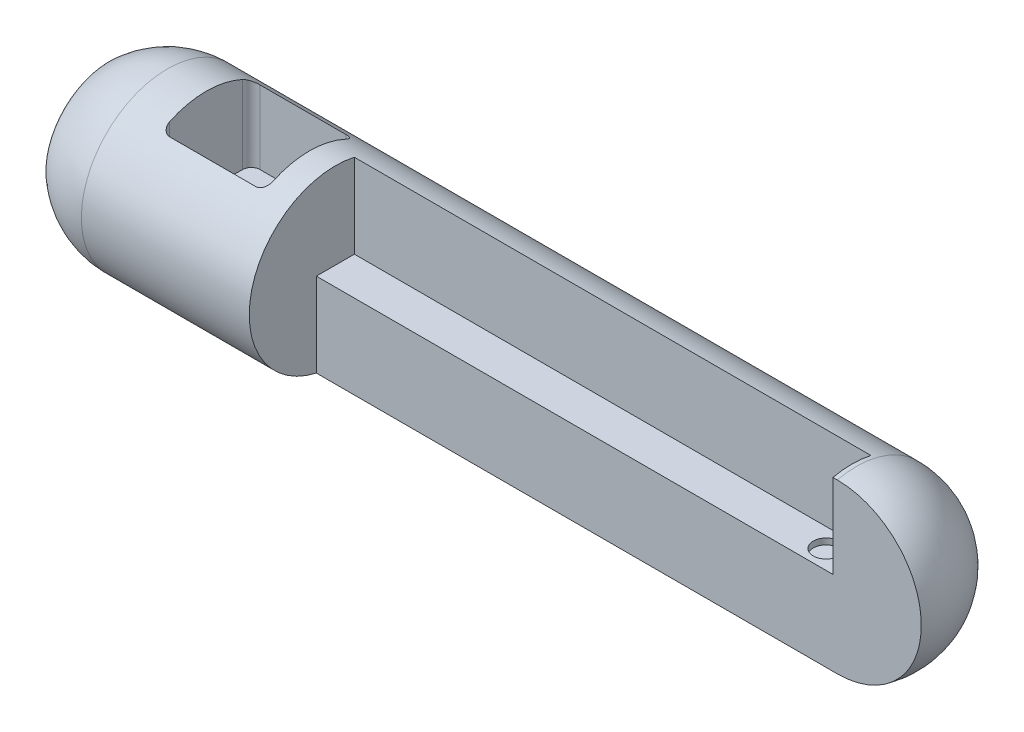
ISO-10303-21;
HEADER;
FILE_DESCRIPTION(('STEP AP214'),'2;1');
FILE_NAME('part.step','',(''),(''),'','','');
FILE_SCHEMA(('AUTOMOTIVE_DESIGN { 1 0 10303 214 1 1 1 1 }'));
ENDSEC;
DATA;
#1=APPLICATION_CONTEXT('core data for automotive mechanical design processes');
#2=APPLICATION_PROTOCOL_DEFINITION('international standard','automotive_design',2000,#1);
#3=PRODUCT_CONTEXT('',#1,'mechanical');
#4=PRODUCT('Part','Part','',(#3));
#5=PRODUCT_RELATED_PRODUCT_CATEGORY('part','',(#4));
#6=PRODUCT_DEFINITION_FORMATION('','',#4);
#7=PRODUCT_DEFINITION_CONTEXT('part definition',#1,'design');
#8=PRODUCT_DEFINITION('design','',#6,#7);
#9=PRODUCT_DEFINITION_SHAPE('','',#8);
#10=(LENGTH_UNIT() NAMED_UNIT(*) SI_UNIT(.MILLI.,.METRE.));
#11=(NAMED_UNIT(*) PLANE_ANGLE_UNIT() SI_UNIT($,.RADIAN.));
#12=(NAMED_UNIT(*) SI_UNIT($,.STERADIAN.) SOLID_ANGLE_UNIT());
#13=UNCERTAINTY_MEASURE_WITH_UNIT(LENGTH_MEASURE(1.E-05),#10,'distance_accuracy_value','');
#14=(GEOMETRIC_REPRESENTATION_CONTEXT(3) GLOBAL_UNCERTAINTY_ASSIGNED_CONTEXT((#13)) GLOBAL_UNIT_ASSIGNED_CONTEXT((#10,
#11,#12)) REPRESENTATION_CONTEXT('',''));
#15=CARTESIAN_POINT('',(0.,0.,0.));
#16=DIRECTION('',(0.,0.,1.));
#17=DIRECTION('',(1.,0.,0.));
#18=AXIS2_PLACEMENT_3D('',#15,#16,#17);
#19=CARTESIAN_POINT('',(0.,0.,0.));
#20=DIRECTION('',(-1.,0.,0.));
#21=DIRECTION('',(0.,0.,1.));
#22=AXIS2_PLACEMENT_3D('',#19,#20,#21);
#23=CYLINDRICAL_SURFACE('',#22,100.);
#24=CARTESIAN_POINT('',(144.992275313291,0.,0.));
#25=DIRECTION('',(1.,0.,0.));
#26=DIRECTION('',(0.,0.,-1.));
#27=AXIS2_PLACEMENT_3D('',#24,#25,#26);
#28=CIRCLE('',#27,100.);
#29=CARTESIAN_POINT('',(144.992275313291,90.5790034168391,-42.3726815296394));
#30=VERTEX_POINT('',#29);
#31=CARTESIAN_POINT('',(144.992275313291,90.5790034168392,42.3726815296393));
#32=VERTEX_POINT('',#31);
#33=EDGE_CURVE('E228',#30,#32,#28,.T.);
#34=ORIENTED_EDGE('',*,*,#33,.F.);
#35=CARTESIAN_POINT('',(144.992275313291,90.5790034168391,-42.3726815296394));
#36=CARTESIAN_POINT('',(144.992266455673,90.4327390532218,-42.6853887241199));
#37=CARTESIAN_POINT('',(145.006941937073,90.2848371835829,-42.9972956829604));
#38=CARTESIAN_POINT('',(145.065155574035,89.9869117356524,-43.6173482393163));
#39=CARTESIAN_POINT('',(145.108690953883,89.8368883627625,-43.9254941956582));
#40=CARTESIAN_POINT('',(145.224187646977,89.5356645003747,-44.5362900965118));
#41=CARTESIAN_POINT('',(145.296182917584,89.3844628169994,-44.8389330221261));
#42=CARTESIAN_POINT('',(145.468057545664,89.0822813849903,-45.436319477874));
#43=CARTESIAN_POINT('',(145.567937535926,88.9313016414712,-45.7310628285757));
#44=CARTESIAN_POINT('',(145.795038811292,88.6308562869436,-46.3106672280128));
#45=CARTESIAN_POINT('',(145.922262647325,88.4813908185663,-46.5955273518524));
#46=CARTESIAN_POINT('',(146.20352508244,88.185341391298,-47.1534232038708));
#47=CARTESIAN_POINT('',(146.357573009516,88.0387584545986,-47.426454777325));
#48=CARTESIAN_POINT('',(146.691794819526,87.750098730746,-47.9584375771485));
#49=CARTESIAN_POINT('',(146.871960823601,87.6080206003555,-48.2173930174908));
#50=CARTESIAN_POINT('',(147.257774886447,87.3299879200957,-48.719148982421));
#51=CARTESIAN_POINT('',(147.463423160135,87.194033421886,-48.9619493707319));
#52=CARTESIAN_POINT('',(147.893416699236,86.9336802151978,-49.4227008348896));
#53=CARTESIAN_POINT('',(148.117098414143,86.8090673792119,-49.6411492840996));
#54=CARTESIAN_POINT('',(148.586703051518,86.5692466260571,-50.0581999249176));
#55=CARTESIAN_POINT('',(148.832614451518,86.4540338947236,-50.256812287198));
#56=CARTESIAN_POINT('',(149.345462151893,86.2349095563728,-50.631882867991));
#57=CARTESIAN_POINT('',(149.612395645411,86.1309964450335,-50.8083440359831));
#58=CARTESIAN_POINT('',(150.165579457019,85.9365107152564,-51.1366066955166));
#59=CARTESIAN_POINT('',(150.451825356201,85.8459350600439,-51.288413801297));
#60=CARTESIAN_POINT('',(151.004998860787,85.6903878142627,-51.5478168037729));
#61=CARTESIAN_POINT('',(151.269954383665,85.6236361101927,-51.6585563345459));
#62=CARTESIAN_POINT('',(151.811034830617,85.5032627887518,-51.8575509786716));
#63=CARTESIAN_POINT('',(152.087157225089,85.4496382169235,-51.945811151521));
#64=CARTESIAN_POINT('',(152.647563022696,85.3567898078448,-52.0982379113052));
#65=CARTESIAN_POINT('',(152.931823843795,85.3175296328827,-52.1624653036134));
#66=CARTESIAN_POINT('',(153.50635729278,85.2541628258315,-52.2659682373049));
#67=CARTESIAN_POINT('',(153.796625089994,85.2300444714877,-52.3052630808252));
#68=CARTESIAN_POINT('',(154.238588367731,85.2054064705927,-52.3453812000194));
#69=CARTESIAN_POINT('',(154.389180251192,85.1991146450061,-52.3556201362944));
#70=CARTESIAN_POINT('',(154.690597701414,85.1907265806318,-52.3692671025232));
#71=CARTESIAN_POINT('',(154.841422728266,85.1886250219639,-52.3726837938726));
#72=CARTESIAN_POINT('',(154.992275313291,85.1886273477567,-52.3726815296394));
#73=B_SPLINE_CURVE_WITH_KNOTS('',3,(#35,#36,#37,#38,#39,#40,#41,#42,#43,#44,#45,#46,#47,#48,#49,
#50,#51,#52,#53,#54,#55,#56,#57,#58,#59,#60,#61,#62,#63,#64,#65,#66,#67,#68,#69,#70,#71,#72),
.UNSPECIFIED.,.F.,.F.,(4,2,2,2,2,2,2,2,2,2,2,2,2,2,2,2,2,2,4),(0.,1.03530983791411,
2.07052011533844,3.10696931642731,4.14344203962534,5.18001149818633,6.2169421430761,
7.25356063268882,8.29018786565977,9.29852019717618,10.3063328373354,11.3140111423901,
12.3214596555464,13.2046453057677,14.0876319987211,14.9683692923994,15.8484239073268,
16.3014494641075,16.7538995014114),.UNSPECIFIED.);
#74=CARTESIAN_POINT('',(154.992275313291,85.1886273477567,-52.3726815296394));
#75=VERTEX_POINT('',#74);
#76=EDGE_CURVE('E49',#30,#75,#73,.T.);
#77=ORIENTED_EDGE('',*,*,#76,.T.);
#78=DIRECTION('',(-1.,0.,0.));
#79=VECTOR('',#78,1.);
#80=CARTESIAN_POINT('',(0.,85.1886273477567,-52.3726815296394));
#81=LINE('',#80,#79);
#82=CARTESIAN_POINT('',(254.992275313291,85.1886273477567,-52.3726815296394));
#83=VERTEX_POINT('',#82);
#84=EDGE_CURVE('E220',#83,#75,#81,.T.);
#85=ORIENTED_EDGE('',*,*,#84,.F.);
#86=CARTESIAN_POINT('',(254.992275313291,85.1886273477567,-52.3726815296394));
#87=CARTESIAN_POINT('',(255.118945991111,85.1886263168288,-52.3726824767199));
#88=CARTESIAN_POINT('',(255.245599384915,85.1901074107686,-52.3702741710501));
#89=CARTESIAN_POINT('',(255.498651280743,85.1960201320163,-52.3606550761205));
#90=CARTESIAN_POINT('',(255.625049789664,85.2004516783693,-52.3534444186283));
#91=CARTESIAN_POINT('',(256.003376527491,85.2181437622612,-52.3246454199057));
#92=CARTESIAN_POINT('',(256.25460363012,85.2358017819059,-52.2958900074209));
#93=CARTESIAN_POINT('',(256.751836404865,85.2824027502174,-52.219859635304));
#94=CARTESIAN_POINT('',(256.997861872163,85.3112889650416,-52.1726777752802));
#95=CARTESIAN_POINT('',(257.484276800406,85.3798410827392,-52.0604173677622));
#96=CARTESIAN_POINT('',(257.724665896163,85.4195076820039,-51.9953376640997));
#97=CARTESIAN_POINT('',(258.197824873569,85.5088880193993,-51.8482155445565));
#98=CARTESIAN_POINT('',(258.430606286671,85.5585856457407,-51.766200325615));
#99=CARTESIAN_POINT('',(258.88768124347,85.6673238387794,-51.5860513247685));
#100=CARTESIAN_POINT('',(259.111971515159,85.7263679625823,-51.4879114055563));
#101=CARTESIAN_POINT('',(259.550957452831,85.8529949190893,-51.2764901793884));
#102=CARTESIAN_POINT('',(259.765647097481,85.9205830114844,-51.1631995430994));
#103=CARTESIAN_POINT('',(260.184409281917,86.0634323947222,-50.9225411103541));
#104=CARTESIAN_POINT('',(260.388477684314,86.1386966424362,-50.7951678876556));
#105=CARTESIAN_POINT('',(260.797821443829,86.3010474836128,-50.5188723053816));
#106=CARTESIAN_POINT('',(261.00234140876,86.3885821398158,-50.3690932040207));
#107=CARTESIAN_POINT('',(261.397684631324,86.5703367826651,-50.0560648253454));
#108=CARTESIAN_POINT('',(261.588502894187,86.664559182598,-49.8928106820359));
#109=CARTESIAN_POINT('',(262.139388164444,86.9557670338308,-49.3846787450864));
#110=CARTESIAN_POINT('',(262.478127892948,87.1613908386324,-49.0212662389981));
#111=CARTESIAN_POINT('',(263.137631046763,87.6180639856599,-48.2008810214119));
#112=CARTESIAN_POINT('',(263.4492763587,87.8714467351585,-47.7379300538733));
#113=CARTESIAN_POINT('',(263.98993676309,88.3896930072042,-46.7713849162086));
#114=CARTESIAN_POINT('',(264.21890237762,88.6545632983953,-46.2677666294085));
#115=CARTESIAN_POINT('',(264.501600361948,89.0599011115411,-45.4799612963182));
#116=CARTESIAN_POINT('',(264.586761184652,89.1992613213622,-45.2060630743392));
#117=CARTESIAN_POINT('',(264.73328873568,89.4779621729497,-44.6518792811238));
#118=CARTESIAN_POINT('',(264.794655019082,89.6173028143015,-44.3715935905552));
#119=CARTESIAN_POINT('',(264.89310140332,89.8948770497267,-43.8065061886779));
#120=CARTESIAN_POINT('',(264.930198079072,90.0331113355214,-43.5217076958163));
#121=CARTESIAN_POINT('',(264.979787916748,90.3076941522166,-42.9490612154214));
#122=CARTESIAN_POINT('',(264.992279814023,90.4440425858294,-42.661213071905));
#123=CARTESIAN_POINT('',(264.992275313291,90.5790034168391,-42.3726815296394));
#124=B_SPLINE_CURVE_WITH_KNOTS('',3,(#86,#87,#88,#89,#90,#91,#92,#93,#94,#95,#96,#97,#98,#99,
#100,#101,#102,#103,#104,#105,#106,#107,#108,#109,#110,#111,#112,#113,#114,#115,#116,#117,#118,
#119,#120,#121,#122,#123),.UNSPECIFIED.,.F.,.F.,(4,2,2,2,2,2,2,2,2,2,2,2,2,2,2,2,2,2,4),(0.,
0.379946210549352,0.759881996515674,1.51925238227265,2.2748346785362,3.03046579551688,
3.78489274371263,4.53960750635184,5.29478915693211,6.05026281172443,6.85398882584001,
7.65800635535124,9.26512344844026,11.096696981441,12.9293647716699,13.8852609326095,
14.8411749665076,15.7964354760417,16.7517450832452),.UNSPECIFIED.);
#125=CARTESIAN_POINT('',(264.992275313291,90.5790034168391,-42.3726815296394));
#126=VERTEX_POINT('',#125);
#127=EDGE_CURVE('E11',#83,#126,#124,.T.);
#128=ORIENTED_EDGE('',*,*,#127,.T.);
#129=CARTESIAN_POINT('',(264.992275313291,0.,0.));
#130=DIRECTION('',(-1.,0.,0.));
#131=DIRECTION('',(0.,0.,1.));
#132=AXIS2_PLACEMENT_3D('',#129,#130,#131);
#133=CIRCLE('',#132,100.);
#134=CARTESIAN_POINT('',(264.992275313291,90.5790034168392,42.3726815296393));
#135=VERTEX_POINT('',#134);
#136=EDGE_CURVE('E222',#135,#126,#133,.T.);
#137=ORIENTED_EDGE('',*,*,#136,.F.);
#138=CARTESIAN_POINT('',(264.992275313291,90.5790034168392,42.3726815296393));
#139=CARTESIAN_POINT('',(264.992284170908,90.4327390532219,42.6853887241197));
#140=CARTESIAN_POINT('',(264.977608689508,90.284837183583,42.9972956829603));
#141=CARTESIAN_POINT('',(264.919395052547,89.9869117356525,43.6173482393161));
#142=CARTESIAN_POINT('',(264.875859672698,89.8368883627626,43.9254941956581));
#143=CARTESIAN_POINT('',(264.760362979605,89.5356645003748,44.5362900965117));
#144=CARTESIAN_POINT('',(264.688367708997,89.3844628169994,44.8389330221259));
#145=CARTESIAN_POINT('',(264.516493080918,89.0822813849903,45.4363194778738));
#146=CARTESIAN_POINT('',(264.416613090656,88.9313016414712,45.7310628285756));
#147=CARTESIAN_POINT('',(264.18951181529,88.6308562869437,46.3106672280126));
#148=CARTESIAN_POINT('',(264.062287979257,88.4813908185664,46.5955273518523));
#149=CARTESIAN_POINT('',(263.781025544142,88.1853413912981,47.1534232038707));
#150=CARTESIAN_POINT('',(263.626977617066,88.0387584545987,47.4264547773249));
#151=CARTESIAN_POINT('',(263.292755807055,87.7500987307461,47.9584375771484));
#152=CARTESIAN_POINT('',(263.112589802981,87.6080206003556,48.2173930174906));
#153=CARTESIAN_POINT('',(262.726775740134,87.3299879200958,48.7191489824208));
#154=CARTESIAN_POINT('',(262.521127466447,87.1940334218861,48.9619493707317));
#155=CARTESIAN_POINT('',(262.091133927346,86.9336802151979,49.4227008348895));
#156=CARTESIAN_POINT('',(261.867452212439,86.809067379212,49.6411492840994));
#157=CARTESIAN_POINT('',(261.397847575064,86.5692466260572,50.0581999249174));
#158=CARTESIAN_POINT('',(261.151936175063,86.4540338947237,50.2568122871979));
#159=CARTESIAN_POINT('',(260.639088474689,86.2349095563729,50.6318828679908));
#160=CARTESIAN_POINT('',(260.372154981171,86.1309964450336,50.808344035983));
#161=CARTESIAN_POINT('',(259.818971169563,85.9365107152565,51.1366066955164));
#162=CARTESIAN_POINT('',(259.532725270381,85.845935060044,51.2884138012968));
#163=CARTESIAN_POINT('',(258.979551765795,85.6903878142628,51.5478168037727));
#164=CARTESIAN_POINT('',(258.714596242917,85.6236361101928,51.6585563345458));
#165=CARTESIAN_POINT('',(258.173515795964,85.5032627887519,51.8575509786714));
#166=CARTESIAN_POINT('',(257.897393401492,85.4496382169236,51.9458111515208));
#167=CARTESIAN_POINT('',(257.336987603886,85.3567898078449,52.098237911305));
#168=CARTESIAN_POINT('',(257.052726782787,85.3175296328828,52.1624653036132));
#169=CARTESIAN_POINT('',(256.478193333802,85.2541628258316,52.2659682373047));
#170=CARTESIAN_POINT('',(256.187925536587,85.2300444714878,52.3052630808251));
#171=CARTESIAN_POINT('',(255.745962258851,85.2054064705928,52.3453812000193));
#172=CARTESIAN_POINT('',(255.595370375389,85.1991146450062,52.3556201362943));
#173=CARTESIAN_POINT('',(255.293952925168,85.1907265806319,52.3692671025231));
#174=CARTESIAN_POINT('',(255.143127898315,85.188625021964,52.3726837938725));
#175=CARTESIAN_POINT('',(254.992275313291,85.1886273477568,52.3726815296393));
#176=B_SPLINE_CURVE_WITH_KNOTS('',3,(#138,#139,#140,#141,#142,#143,#144,#145,#146,#147,#148,
#149,#150,#151,#152,#153,#154,#155,#156,#157,#158,#159,#160,#161,#162,#163,#164,#165,#166,#167,
#168,#169,#170,#171,#172,#173,#174,#175),.UNSPECIFIED.,.F.,.F.,(4,2,2,2,2,2,2,2,2,2,2,2,2,2,2,2,
2,2,4),(0.,1.03530983791409,2.07052011533841,3.1069693164273,4.14344203962532,5.18001149818632,
6.21694214307607,7.25356063268874,8.29018786565969,9.29852019717612,10.3063328373353,
11.31401114239,12.3214596555464,13.2046453057676,14.087631998721,14.9683692923993,
15.8484239073267,16.3014494641074,16.7538995014114),.UNSPECIFIED.);
#177=CARTESIAN_POINT('',(254.992275313291,85.1886273477567,52.3726815296393));
#178=VERTEX_POINT('',#177);
#179=EDGE_CURVE('E258',#135,#178,#176,.T.);
#180=ORIENTED_EDGE('',*,*,#179,.T.);
#181=DIRECTION('',(-1.,0.,0.));
#182=VECTOR('',#181,1.);
#183=CARTESIAN_POINT('',(0.,85.1886273477567,52.3726815296393));
#184=LINE('',#183,#182);
#185=CARTESIAN_POINT('',(154.992275313291,85.1886273477567,52.3726815296393));
#186=VERTEX_POINT('',#185);
#187=EDGE_CURVE('E225',#186,#178,#184,.F.);
#188=ORIENTED_EDGE('',*,*,#187,.F.);
#189=CARTESIAN_POINT('',(154.992275313291,85.1886273477567,52.3726815296393));
#190=CARTESIAN_POINT('',(154.865604635471,85.1886263168288,52.3726824767198));
#191=CARTESIAN_POINT('',(154.738951241666,85.1901074107686,52.3702741710499));
#192=CARTESIAN_POINT('',(154.485899345838,85.1960201320164,52.3606550761204));
#193=CARTESIAN_POINT('',(154.359500836917,85.2004516783694,52.3534444186282));
#194=CARTESIAN_POINT('',(153.98117409909,85.2181437622613,52.3246454199055));
#195=CARTESIAN_POINT('',(153.729946996462,85.2358017819059,52.2958900074208));
#196=CARTESIAN_POINT('',(153.232714221716,85.2824027502175,52.2198596353039));
#197=CARTESIAN_POINT('',(152.986688754419,85.3112889650417,52.1726777752801));
#198=CARTESIAN_POINT('',(152.500273826176,85.3798410827393,52.0604173677621));
#199=CARTESIAN_POINT('',(152.259884730419,85.4195076820039,51.9953376640996));
#200=CARTESIAN_POINT('',(151.786725753012,85.5088880193994,51.8482155445563));
#201=CARTESIAN_POINT('',(151.553944339911,85.5585856457407,51.7662003256149));
#202=CARTESIAN_POINT('',(151.096869383112,85.6673238387795,51.5860513247683));
#203=CARTESIAN_POINT('',(150.872579111422,85.7263679625824,51.4879114055562));
#204=CARTESIAN_POINT('',(150.433593173751,85.8529949190894,51.2764901793883));
#205=CARTESIAN_POINT('',(150.2189035291,85.9205830114845,51.1631995430993));
#206=CARTESIAN_POINT('',(149.800141344664,86.0634323947223,50.922541110354));
#207=CARTESIAN_POINT('',(149.596072942267,86.1386966424363,50.7951678876555));
#208=CARTESIAN_POINT('',(149.186729182753,86.3010474836128,50.5188723053815));
#209=CARTESIAN_POINT('',(148.982209217821,86.3885821398159,50.3690932040206));
#210=CARTESIAN_POINT('',(148.586865995258,86.5703367826651,50.0560648253453));
#211=CARTESIAN_POINT('',(148.396047732394,86.6645591825981,49.8928106820357));
#212=CARTESIAN_POINT('',(147.845162462137,86.9557670338308,49.3846787450863));
#213=CARTESIAN_POINT('',(147.506422733634,87.1613908386324,49.021266238998));
#214=CARTESIAN_POINT('',(146.846919579819,87.61806398566,48.2008810214118));
#215=CARTESIAN_POINT('',(146.535274267882,87.8714467351585,47.7379300538732));
#216=CARTESIAN_POINT('',(145.994613863492,88.3896930072043,46.7713849162085));
#217=CARTESIAN_POINT('',(145.765648248962,88.6545632983953,46.2677666294084));
#218=CARTESIAN_POINT('',(145.482950264634,89.0599011115411,45.4799612963181));
#219=CARTESIAN_POINT('',(145.397789441929,89.1992613213622,45.2060630743391));
#220=CARTESIAN_POINT('',(145.251261890901,89.4779621729497,44.6518792811237));
#221=CARTESIAN_POINT('',(145.1898956075,89.6173028143016,44.3715935905551));
#222=CARTESIAN_POINT('',(145.091449223261,89.8948770497268,43.8065061886778));
#223=CARTESIAN_POINT('',(145.054352547509,90.0331113355215,43.5217076958162));
#224=CARTESIAN_POINT('',(145.004762709833,90.3076941522166,42.9490612154213));
#225=CARTESIAN_POINT('',(144.992270812559,90.4440425858295,42.6612130719049));
#226=CARTESIAN_POINT('',(144.992275313291,90.5790034168392,42.3726815296393));
#227=B_SPLINE_CURVE_WITH_KNOTS('',3,(#189,#190,#191,#192,#193,#194,#195,#196,#197,#198,#199,
#200,#201,#202,#203,#204,#205,#206,#207,#208,#209,#210,#211,#212,#213,#214,#215,#216,#217,#218,
#219,#220,#221,#222,#223,#224,#225,#226),.UNSPECIFIED.,.F.,.F.,(4,2,2,2,2,2,2,2,2,2,2,2,2,2,2,2,
2,2,4),(0.,0.379946210549297,0.759881996515591,1.51925238227257,2.2748346785362,
3.03046579551686,3.78489274371261,4.53960750635185,5.29478915693211,6.05026281172439,
6.85398882584004,7.65800635535117,9.26512344844022,11.0966969814409,12.9293647716699,
13.8852609326095,14.8411749665075,15.7964354760417,16.7517450832452),.UNSPECIFIED.);
#228=EDGE_CURVE('E265',#186,#32,#227,.T.);
#229=ORIENTED_EDGE('',*,*,#228,.T.);
#230=EDGE_LOOP('',(#34,#77,#85,#128,#137,#180,#188,#229));
#231=FACE_BOUND('',#230,.T.);
#232=CARTESIAN_POINT('',(99.9999999999999,0.,0.));
#233=DIRECTION('',(-1.,0.,0.));
#234=DIRECTION('',(0.,0.,1.));
#235=AXIS2_PLACEMENT_3D('',#232,#233,#234);
#236=CIRCLE('',#235,99.9999999999999);
#237=CARTESIAN_POINT('',(99.9999999999999,0.,99.9999999999999));
#238=VERTEX_POINT('',#237);
#239=EDGE_CURVE('E207',#238,#238,#236,.T.);
#240=ORIENTED_EDGE('',*,*,#239,.F.);
#241=EDGE_LOOP('',(#240));
#242=FACE_BOUND('',#241,.T.);
#243=DIRECTION('',(-1.,0.,0.));
#244=VECTOR('',#243,1.);
#245=CARTESIAN_POINT('',(0.,97.532026968896,22.0794863015094));
#246=LINE('',#245,#244);
#247=CARTESIAN_POINT('',(900.,97.532026968896,22.0794863015094));
#248=VERTEX_POINT('',#247);
#249=CARTESIAN_POINT('',(895.,97.5320269688959,22.0794863015094));
#250=VERTEX_POINT('',#249);
#251=EDGE_CURVE('E165',#248,#250,#246,.T.);
#252=ORIENTED_EDGE('',*,*,#251,.F.);
#253=CARTESIAN_POINT('',(900.,0.,0.));
#254=DIRECTION('',(-1.,0.,0.));
#255=DIRECTION('',(0.,0.,1.));
#256=AXIS2_PLACEMENT_3D('',#253,#254,#255);
#257=CIRCLE('',#256,100.);
#258=CARTESIAN_POINT('',(900.,-97.532026968896,22.0794863015094));
#259=VERTEX_POINT('',#258);
#260=EDGE_CURVE('E152',#248,#259,#257,.T.);
#261=ORIENTED_EDGE('',*,*,#260,.T.);
#262=DIRECTION('',(-1.,0.,0.));
#263=VECTOR('',#262,1.);
#264=CARTESIAN_POINT('',(0.,-97.532026968896,22.0794863015094));
#265=LINE('',#264,#263);
#266=CARTESIAN_POINT('',(295.,-97.532026968896,22.0794863015094));
#267=VERTEX_POINT('',#266);
#268=EDGE_CURVE('E156',#267,#259,#265,.F.);
#269=ORIENTED_EDGE('',*,*,#268,.F.);
#270=CARTESIAN_POINT('',(295.,0.,0.));
#271=DIRECTION('',(1.,0.,0.));
#272=DIRECTION('',(0.,0.,-1.));
#273=AXIS2_PLACEMENT_3D('',#270,#271,#272);
#274=CIRCLE('',#273,100.);
#275=CARTESIAN_POINT('',(295.,97.532026968896,-22.0794863015094));
#276=VERTEX_POINT('',#275);
#277=EDGE_CURVE('E139',#276,#267,#274,.T.);
#278=ORIENTED_EDGE('',*,*,#277,.F.);
#279=DIRECTION('',(-1.,0.,0.));
#280=VECTOR('',#279,1.);
#281=CARTESIAN_POINT('',(0.,97.532026968896,-22.0794863015094));
#282=LINE('',#281,#280);
#283=CARTESIAN_POINT('',(895.,97.532026968896,-22.0794863015094));
#284=VERTEX_POINT('',#283);
#285=EDGE_CURVE('E212',#284,#276,#282,.T.);
#286=ORIENTED_EDGE('',*,*,#285,.F.);
#287=CARTESIAN_POINT('',(895.,0.,0.));
#288=DIRECTION('',(-1.,0.,0.));
#289=DIRECTION('',(0.,0.,1.));
#290=AXIS2_PLACEMENT_3D('',#287,#288,#289);
#291=CIRCLE('',#290,100.);
#292=EDGE_CURVE('E151',#250,#284,#291,.T.);
#293=ORIENTED_EDGE('',*,*,#292,.F.);
#294=EDGE_LOOP('',(#252,#261,#269,#278,#286,#293));
#295=FACE_BOUND('',#294,.T.);
#296=ADVANCED_FACE('F35',(#231,#242,#295),#23,.T.);
#297=CARTESIAN_POINT('',(900.,0.,0.));
#298=DIRECTION('',(-1.,0.,0.));
#299=DIRECTION('',(0.,0.,-1.));
#300=AXIS2_PLACEMENT_3D('',#297,#298,#299);
#301=SPHERICAL_SURFACE('',#300,100.);
#302=CARTESIAN_POINT('',(900.,0.,22.0794863015094));
#303=DIRECTION('',(0.,0.,1.));
#304=DIRECTION('',(1.,0.,0.));
#305=AXIS2_PLACEMENT_3D('',#302,#303,#304);
#306=CIRCLE('',#305,97.532026968896);
#307=EDGE_CURVE('E160',#259,#248,#306,.T.);
#308=ORIENTED_EDGE('',*,*,#307,.F.);
#309=ORIENTED_EDGE('',*,*,#260,.F.);
#310=EDGE_LOOP('',(#308,#309));
#311=FACE_BOUND('',#310,.T.);
#312=ADVANCED_FACE('F328',(#311),#301,.T.);
#313=CARTESIAN_POINT('',(99.9999999999999,0.,0.));
#314=DIRECTION('',(-1.,0.,0.));
#315=DIRECTION('',(0.,0.,-1.));
#316=AXIS2_PLACEMENT_3D('',#313,#314,#315);
#317=SPHERICAL_SURFACE('',#316,99.9999999999999);
#318=CARTESIAN_POINT('',(33.3333333333334,0.,0.));
#319=DIRECTION('',(1.,0.,0.));
#320=DIRECTION('',(0.,0.,-1.));
#321=AXIS2_PLACEMENT_3D('',#318,#319,#320);
#322=CIRCLE('',#321,74.535599249993);
#323=CARTESIAN_POINT('',(33.3333333333334,0.,-74.5355992499929));
#324=VERTEX_POINT('',#323);
#325=EDGE_CURVE('E214',#324,#324,#322,.T.);
#326=ORIENTED_EDGE('',*,*,#325,.T.);
#327=EDGE_LOOP('',(#326));
#328=FACE_BOUND('',#327,.T.);
#329=ORIENTED_EDGE('',*,*,#239,.T.);
#330=EDGE_LOOP('',(#329));
#331=FACE_BOUND('',#330,.T.);
#332=ADVANCED_FACE('F332',(#328,#331),#317,.T.);
#333=CARTESIAN_POINT('',(30.,-100.,-74.8272286547285));
#334=DIRECTION('',(1.,0.,0.));
#335=DIRECTION('',(0.,0.,-1.));
#336=AXIS2_PLACEMENT_3D('',#333,#334,#335);
#337=PLANE('',#336);
#338=CARTESIAN_POINT('',(30.,0.,0.));
#339=DIRECTION('',(-1.,0.,0.));
#340=DIRECTION('',(0.,0.,1.));
#341=AXIS2_PLACEMENT_3D('',#338,#339,#340);
#342=CIRCLE('',#341,7.93749999999999);
#343=CARTESIAN_POINT('',(30.,0.,7.93749999999998));
#344=VERTEX_POINT('',#343);
#345=EDGE_CURVE('E188',#344,#344,#342,.T.);
#346=ORIENTED_EDGE('',*,*,#345,.F.);
#347=EDGE_LOOP('',(#346));
#348=FACE_BOUND('',#347,.T.);
#349=CARTESIAN_POINT('',(30.,0.,0.));
#350=DIRECTION('',(1.,0.,0.));
#351=DIRECTION('',(0.,0.,-1.));
#352=AXIS2_PLACEMENT_3D('',#349,#350,#351);
#353=CIRCLE('',#352,67.0820393249937);
#354=CARTESIAN_POINT('',(30.,0.,-67.0820393249937));
#355=VERTEX_POINT('',#354);
#356=EDGE_CURVE('E217',#355,#355,#353,.F.);
#357=ORIENTED_EDGE('',*,*,#356,.T.);
#358=EDGE_LOOP('',(#357));
#359=FACE_BOUND('',#358,.T.);
#360=ADVANCED_FACE('F337',(#348,#359),#337,.F.);
#361=CARTESIAN_POINT('',(895.,100.,-22.0794863015094));
#362=DIRECTION('',(-1.,0.,0.));
#363=DIRECTION('',(0.,0.,1.));
#364=AXIS2_PLACEMENT_3D('',#361,#362,#363);
#365=PLANE('',#364);
#366=DIRECTION('',(0.,-1.,0.));
#367=VECTOR('',#366,1.);
#368=CARTESIAN_POINT('',(895.,100.,22.0794863015093));
#369=LINE('',#368,#367);
#370=CARTESIAN_POINT('',(895.,0.,22.0794863015093));
#371=VERTEX_POINT('',#370);
#372=EDGE_CURVE('E202',#250,#371,#369,.T.);
#373=ORIENTED_EDGE('',*,*,#372,.F.);
#374=ORIENTED_EDGE('',*,*,#292,.T.);
#375=DIRECTION('',(0.,-1.,0.));
#376=VECTOR('',#375,1.);
#377=CARTESIAN_POINT('',(895.,100.,-22.0794863015094));
#378=LINE('',#377,#376);
#379=CARTESIAN_POINT('',(895.,0.,-22.0794863015094));
#380=VERTEX_POINT('',#379);
#381=EDGE_CURVE('E205',#284,#380,#378,.T.);
#382=ORIENTED_EDGE('',*,*,#381,.T.);
#383=DIRECTION('',(0.,0.,-1.));
#384=VECTOR('',#383,1.);
#385=CARTESIAN_POINT('',(895.,0.,-22.0794863015094));
#386=LINE('',#385,#384);
#387=EDGE_CURVE('E194',#371,#380,#386,.T.);
#388=ORIENTED_EDGE('',*,*,#387,.F.);
#389=EDGE_LOOP('',(#373,#374,#382,#388));
#390=FACE_BOUND('',#389,.T.);
#391=ADVANCED_FACE('F344',(#390),#365,.T.);
#392=CARTESIAN_POINT('',(295.,100.,-22.0794863015094));
#393=DIRECTION('',(0.,0.,1.));
#394=DIRECTION('',(1.,0.,0.));
#395=AXIS2_PLACEMENT_3D('',#392,#393,#394);
#396=PLANE('',#395);
#397=DIRECTION('',(0.,-1.,0.));
#398=VECTOR('',#397,1.);
#399=CARTESIAN_POINT('',(295.,100.,-22.0794863015094));
#400=LINE('',#399,#398);
#401=CARTESIAN_POINT('',(295.,0.,-22.0794863015094));
#402=VERTEX_POINT('',#401);
#403=EDGE_CURVE('E146',#276,#402,#400,.T.);
#404=ORIENTED_EDGE('',*,*,#403,.T.);
#405=DIRECTION('',(-1.,0.,0.));
#406=VECTOR('',#405,1.);
#407=CARTESIAN_POINT('',(295.,0.,-22.0794863015094));
#408=LINE('',#407,#406);
#409=EDGE_CURVE('E197',#380,#402,#408,.T.);
#410=ORIENTED_EDGE('',*,*,#409,.F.);
#411=ORIENTED_EDGE('',*,*,#381,.F.);
#412=ORIENTED_EDGE('',*,*,#285,.T.);
#413=EDGE_LOOP('',(#404,#410,#411,#412));
#414=FACE_BOUND('',#413,.T.);
#415=ADVANCED_FACE('F349',(#414),#396,.T.);
#416=CARTESIAN_POINT('',(295.,100.,-22.0794863015094));
#417=DIRECTION('',(1.,0.,0.));
#418=DIRECTION('',(0.,0.,-1.));
#419=AXIS2_PLACEMENT_3D('',#416,#417,#418);
#420=PLANE('',#419);
#421=ORIENTED_EDGE('',*,*,#403,.F.);
#422=ORIENTED_EDGE('',*,*,#277,.T.);
#423=DIRECTION('',(0.,1.,0.));
#424=VECTOR('',#423,1.);
#425=CARTESIAN_POINT('',(295.,-100.,22.0794863015094));
#426=LINE('',#425,#424);
#427=CARTESIAN_POINT('',(295.,0.,22.0794863015094));
#428=VERTEX_POINT('',#427);
#429=EDGE_CURVE('E143',#267,#428,#426,.T.);
#430=ORIENTED_EDGE('',*,*,#429,.T.);
#431=DIRECTION('',(0.,0.,1.));
#432=VECTOR('',#431,1.);
#433=CARTESIAN_POINT('',(295.,0.,-22.0794863015094));
#434=LINE('',#433,#432);
#435=EDGE_CURVE('E199',#402,#428,#434,.T.);
#436=ORIENTED_EDGE('',*,*,#435,.F.);
#437=EDGE_LOOP('',(#421,#422,#430,#436));
#438=FACE_BOUND('',#437,.T.);
#439=ADVANCED_FACE('F141',(#438),#420,.T.);
#440=CARTESIAN_POINT('',(0.,0.,0.));
#441=DIRECTION('',(0.,1.,0.));
#442=DIRECTION('',(0.,0.,1.));
#443=AXIS2_PLACEMENT_3D('',#440,#441,#442);
#444=PLANE('',#443);
#445=CARTESIAN_POINT('',(865.,0.,0.));
#446=DIRECTION('',(0.,1.,0.));
#447=DIRECTION('',(0.,0.,1.));
#448=AXIS2_PLACEMENT_3D('',#445,#446,#447);
#449=CIRCLE('',#448,15.);
#450=CARTESIAN_POINT('',(865.,0.,15.));
#451=VERTEX_POINT('',#450);
#452=EDGE_CURVE('E167',#451,#451,#449,.T.);
#453=ORIENTED_EDGE('',*,*,#452,.F.);
#454=EDGE_LOOP('',(#453));
#455=FACE_BOUND('',#454,.T.);
#456=ORIENTED_EDGE('',*,*,#409,.T.);
#457=ORIENTED_EDGE('',*,*,#435,.T.);
#458=DIRECTION('',(1.,0.,0.));
#459=VECTOR('',#458,1.);
#460=CARTESIAN_POINT('',(295.,0.,22.0794863015094));
#461=LINE('',#460,#459);
#462=EDGE_CURVE('E159',#428,#371,#461,.T.);
#463=ORIENTED_EDGE('',*,*,#462,.T.);
#464=ORIENTED_EDGE('',*,*,#387,.T.);
#465=EDGE_LOOP('',(#456,#457,#463,#464));
#466=FACE_BOUND('',#465,.T.);
#467=ADVANCED_FACE('F346',(#455,#466),#444,.T.);
#468=CARTESIAN_POINT('',(40.,0.,0.));
#469=DIRECTION('',(1.,0.,0.));
#470=DIRECTION('',(0.,0.,-1.));
#471=AXIS2_PLACEMENT_3D('',#468,#469,#470);
#472=TOROIDAL_SURFACE('',#471,67.0820393249937,10.);
#473=ORIENTED_EDGE('',*,*,#356,.F.);
#474=EDGE_LOOP('',(#473));
#475=FACE_BOUND('',#474,.T.);
#476=ORIENTED_EDGE('',*,*,#325,.F.);
#477=EDGE_LOOP('',(#476));
#478=FACE_BOUND('',#477,.T.);
#479=ADVANCED_FACE('F281',(#475,#478),#472,.T.);
#480=CARTESIAN_POINT('',(60.,0.,0.));
#481=DIRECTION('',(-1.,0.,0.));
#482=DIRECTION('',(0.,0.,1.));
#483=AXIS2_PLACEMENT_3D('',#480,#481,#482);
#484=CONICAL_SURFACE('',#483,7.93749999999999,1.02974425867665);
#485=CARTESIAN_POINT('',(64.7693311635313,0.,0.));
#486=VERTEX_POINT('',#485);
#487=VERTEX_LOOP('',#486);
#488=FACE_BOUND('',#487,.T.);
#489=CARTESIAN_POINT('',(60.,0.,0.));
#490=DIRECTION('',(-1.,0.,0.));
#491=DIRECTION('',(0.,0.,1.));
#492=AXIS2_PLACEMENT_3D('',#489,#490,#491);
#493=CIRCLE('',#492,7.93749999999999);
#494=CARTESIAN_POINT('',(60.,0.,7.93749999999999));
#495=VERTEX_POINT('',#494);
#496=EDGE_CURVE('E191',#495,#495,#493,.T.);
#497=ORIENTED_EDGE('',*,*,#496,.T.);
#498=EDGE_LOOP('',(#497));
#499=FACE_BOUND('',#498,.T.);
#500=ADVANCED_FACE('F369',(#488,#499),#484,.F.);
#501=CARTESIAN_POINT('',(30.,0.,0.));
#502=DIRECTION('',(-1.,0.,0.));
#503=DIRECTION('',(0.,0.,1.));
#504=AXIS2_PLACEMENT_3D('',#501,#502,#503);
#505=CYLINDRICAL_SURFACE('',#504,7.93749999999999);
#506=ORIENTED_EDGE('',*,*,#496,.F.);
#507=EDGE_LOOP('',(#506));
#508=FACE_BOUND('',#507,.T.);
#509=ORIENTED_EDGE('',*,*,#345,.T.);
#510=EDGE_LOOP('',(#509));
#511=FACE_BOUND('',#510,.T.);
#512=ADVANCED_FACE('F377',(#508,#511),#505,.F.);
#513=CARTESIAN_POINT('',(144.992275313291,161.,52.3726815296393));
#514=DIRECTION('',(1.,0.,0.));
#515=DIRECTION('',(0.,0.,-1.));
#516=AXIS2_PLACEMENT_3D('',#513,#514,#515);
#517=PLANE('',#516);
#518=ORIENTED_EDGE('',*,*,#33,.T.);
#519=DIRECTION('',(0.,-1.,0.));
#520=VECTOR('',#519,1.);
#521=CARTESIAN_POINT('',(144.992275313291,0.,42.3726815296393));
#522=LINE('',#521,#520);
#523=CARTESIAN_POINT('',(144.992275313291,0.,42.3726815296393));
#524=VERTEX_POINT('',#523);
#525=EDGE_CURVE('E251',#32,#524,#522,.T.);
#526=ORIENTED_EDGE('',*,*,#525,.T.);
#527=DIRECTION('',(0.,0.,1.));
#528=VECTOR('',#527,1.);
#529=CARTESIAN_POINT('',(144.992275313291,0.,52.3726815296393));
#530=LINE('',#529,#528);
#531=CARTESIAN_POINT('',(144.992275313291,0.,-42.3726815296394));
#532=VERTEX_POINT('',#531);
#533=EDGE_CURVE('E174',#532,#524,#530,.T.);
#534=ORIENTED_EDGE('',*,*,#533,.F.);
#535=DIRECTION('',(0.,-1.,0.));
#536=VECTOR('',#535,1.);
#537=CARTESIAN_POINT('',(144.992275313291,85.1886273477567,-42.3726815296394));
#538=LINE('',#537,#536);
#539=EDGE_CURVE('E249',#532,#30,#538,.F.);
#540=ORIENTED_EDGE('',*,*,#539,.T.);
#541=EDGE_LOOP('',(#518,#526,#534,#540));
#542=FACE_BOUND('',#541,.T.);
#543=ADVANCED_FACE('F300',(#542),#517,.T.);
#544=CARTESIAN_POINT('',(264.992275313291,161.,52.3726815296393));
#545=DIRECTION('',(0.,0.,-1.));
#546=DIRECTION('',(-1.,0.,0.));
#547=AXIS2_PLACEMENT_3D('',#544,#545,#546);
#548=PLANE('',#547);
#549=ORIENTED_EDGE('',*,*,#187,.T.);
#550=DIRECTION('',(0.,-1.,0.));
#551=VECTOR('',#550,1.);
#552=CARTESIAN_POINT('',(254.992275313291,0.,52.3726815296393));
#553=LINE('',#552,#551);
#554=CARTESIAN_POINT('',(254.992275313291,0.,52.3726815296393));
#555=VERTEX_POINT('',#554);
#556=EDGE_CURVE('E233',#178,#555,#553,.T.);
#557=ORIENTED_EDGE('',*,*,#556,.T.);
#558=DIRECTION('',(1.,0.,0.));
#559=VECTOR('',#558,1.);
#560=CARTESIAN_POINT('',(264.992275313291,0.,52.3726815296393));
#561=LINE('',#560,#559);
#562=CARTESIAN_POINT('',(154.992275313291,0.,52.3726815296393));
#563=VERTEX_POINT('',#562);
#564=EDGE_CURVE('E179',#563,#555,#561,.T.);
#565=ORIENTED_EDGE('',*,*,#564,.F.);
#566=DIRECTION('',(0.,-1.,0.));
#567=VECTOR('',#566,1.);
#568=CARTESIAN_POINT('',(154.992275313291,85.1886273477567,52.3726815296393));
#569=LINE('',#568,#567);
#570=EDGE_CURVE('E231',#563,#186,#569,.F.);
#571=ORIENTED_EDGE('',*,*,#570,.T.);
#572=EDGE_LOOP('',(#549,#557,#565,#571));
#573=FACE_BOUND('',#572,.T.);
#574=ADVANCED_FACE('F306',(#573),#548,.T.);
#575=CARTESIAN_POINT('',(264.992275313291,161.,52.3726815296393));
#576=DIRECTION('',(-1.,0.,0.));
#577=DIRECTION('',(0.,0.,1.));
#578=AXIS2_PLACEMENT_3D('',#575,#576,#577);
#579=PLANE('',#578);
#580=DIRECTION('',(0.,0.,-1.));
#581=VECTOR('',#580,1.);
#582=CARTESIAN_POINT('',(264.992275313291,0.,52.3726815296393));
#583=LINE('',#582,#581);
#584=CARTESIAN_POINT('',(264.992275313291,0.,42.3726815296393));
#585=VERTEX_POINT('',#584);
#586=CARTESIAN_POINT('',(264.992275313291,0.,-42.3726815296394));
#587=VERTEX_POINT('',#586);
#588=EDGE_CURVE('E182',#585,#587,#583,.T.);
#589=ORIENTED_EDGE('',*,*,#588,.F.);
#590=DIRECTION('',(0.,-1.,0.));
#591=VECTOR('',#590,1.);
#592=CARTESIAN_POINT('',(264.992275313291,85.1886273477568,42.3726815296393));
#593=LINE('',#592,#591);
#594=EDGE_CURVE('E247',#585,#135,#593,.F.);
#595=ORIENTED_EDGE('',*,*,#594,.T.);
#596=ORIENTED_EDGE('',*,*,#136,.T.);
#597=DIRECTION('',(0.,-1.,0.));
#598=VECTOR('',#597,1.);
#599=CARTESIAN_POINT('',(264.992275313291,0.,-42.3726815296394));
#600=LINE('',#599,#598);
#601=EDGE_CURVE('E244',#126,#587,#600,.T.);
#602=ORIENTED_EDGE('',*,*,#601,.T.);
#603=EDGE_LOOP('',(#589,#595,#596,#602));
#604=FACE_BOUND('',#603,.T.);
#605=ADVANCED_FACE('F312',(#604),#579,.T.);
#606=CARTESIAN_POINT('',(264.992275313291,161.,-52.3726815296394));
#607=DIRECTION('',(0.,0.,1.));
#608=DIRECTION('',(1.,0.,0.));
#609=AXIS2_PLACEMENT_3D('',#606,#607,#608);
#610=PLANE('',#609);
#611=ORIENTED_EDGE('',*,*,#84,.T.);
#612=DIRECTION('',(0.,-1.,0.));
#613=VECTOR('',#612,1.);
#614=CARTESIAN_POINT('',(154.992275313291,0.,-52.3726815296394));
#615=LINE('',#614,#613);
#616=CARTESIAN_POINT('',(154.992275313291,0.,-52.3726815296394));
#617=VERTEX_POINT('',#616);
#618=EDGE_CURVE('E255',#75,#617,#615,.T.);
#619=ORIENTED_EDGE('',*,*,#618,.T.);
#620=DIRECTION('',(-1.,0.,0.));
#621=VECTOR('',#620,1.);
#622=CARTESIAN_POINT('',(264.992275313291,0.,-52.3726815296394));
#623=LINE('',#622,#621);
#624=CARTESIAN_POINT('',(254.992275313291,0.,-52.3726815296394));
#625=VERTEX_POINT('',#624);
#626=EDGE_CURVE('E185',#625,#617,#623,.T.);
#627=ORIENTED_EDGE('',*,*,#626,.F.);
#628=DIRECTION('',(0.,-1.,0.));
#629=VECTOR('',#628,1.);
#630=CARTESIAN_POINT('',(254.992275313291,85.1886273477567,-52.3726815296394));
#631=LINE('',#630,#629);
#632=EDGE_CURVE('E62',#625,#83,#631,.F.);
#633=ORIENTED_EDGE('',*,*,#632,.T.);
#634=EDGE_LOOP('',(#611,#619,#627,#633));
#635=FACE_BOUND('',#634,.T.);
#636=ADVANCED_FACE('F317',(#635),#610,.T.);
#637=CARTESIAN_POINT('',(0.,0.,0.));
#638=DIRECTION('',(0.,1.,0.));
#639=DIRECTION('',(0.,0.,1.));
#640=AXIS2_PLACEMENT_3D('',#637,#638,#639);
#641=PLANE('',#640);
#642=ORIENTED_EDGE('',*,*,#564,.T.);
#643=CARTESIAN_POINT('',(254.992275313291,0.,42.3726815296393));
#644=DIRECTION('',(0.,1.,0.));
#645=DIRECTION('',(0.,0.,1.));
#646=AXIS2_PLACEMENT_3D('',#643,#644,#645);
#647=CIRCLE('',#646,10.);
#648=EDGE_CURVE('E242',#555,#585,#647,.T.);
#649=ORIENTED_EDGE('',*,*,#648,.T.);
#650=ORIENTED_EDGE('',*,*,#588,.T.);
#651=CARTESIAN_POINT('',(254.992275313291,0.,-42.3726815296394));
#652=DIRECTION('',(0.,1.,0.));
#653=DIRECTION('',(0.,0.,1.));
#654=AXIS2_PLACEMENT_3D('',#651,#652,#653);
#655=CIRCLE('',#654,10.);
#656=EDGE_CURVE('E236',#587,#625,#655,.T.);
#657=ORIENTED_EDGE('',*,*,#656,.T.);
#658=ORIENTED_EDGE('',*,*,#626,.T.);
#659=CARTESIAN_POINT('',(154.992275313291,0.,-42.3726815296394));
#660=DIRECTION('',(0.,1.,0.));
#661=DIRECTION('',(0.,0.,1.));
#662=AXIS2_PLACEMENT_3D('',#659,#660,#661);
#663=CIRCLE('',#662,10.);
#664=EDGE_CURVE('E238',#617,#532,#663,.T.);
#665=ORIENTED_EDGE('',*,*,#664,.T.);
#666=ORIENTED_EDGE('',*,*,#533,.T.);
#667=CARTESIAN_POINT('',(154.992275313291,0.,42.3726815296393));
#668=DIRECTION('',(0.,1.,0.));
#669=DIRECTION('',(0.,0.,1.));
#670=AXIS2_PLACEMENT_3D('',#667,#668,#669);
#671=CIRCLE('',#670,10.);
#672=EDGE_CURVE('E240',#524,#563,#671,.T.);
#673=ORIENTED_EDGE('',*,*,#672,.T.);
#674=EDGE_LOOP('',(#642,#649,#650,#657,#658,#665,#666,#673));
#675=FACE_BOUND('',#674,.T.);
#676=ADVANCED_FACE('F279',(#675),#641,.T.);
#677=CARTESIAN_POINT('',(254.992275313291,161.,42.3726815296393));
#678=DIRECTION('',(0.,1.,0.));
#679=DIRECTION('',(0.,0.,1.));
#680=AXIS2_PLACEMENT_3D('',#677,#678,#679);
#681=CYLINDRICAL_SURFACE('',#680,10.);
#682=ORIENTED_EDGE('',*,*,#179,.F.);
#683=ORIENTED_EDGE('',*,*,#594,.F.);
#684=ORIENTED_EDGE('',*,*,#648,.F.);
#685=ORIENTED_EDGE('',*,*,#556,.F.);
#686=EDGE_LOOP('',(#682,#683,#684,#685));
#687=FACE_BOUND('',#686,.T.);
#688=ADVANCED_FACE('F274',(#687),#681,.F.);
#689=CARTESIAN_POINT('',(154.992275313291,161.,42.3726815296393));
#690=DIRECTION('',(0.,1.,0.));
#691=DIRECTION('',(0.,0.,1.));
#692=AXIS2_PLACEMENT_3D('',#689,#690,#691);
#693=CYLINDRICAL_SURFACE('',#692,10.);
#694=ORIENTED_EDGE('',*,*,#228,.F.);
#695=ORIENTED_EDGE('',*,*,#570,.F.);
#696=ORIENTED_EDGE('',*,*,#672,.F.);
#697=ORIENTED_EDGE('',*,*,#525,.F.);
#698=EDGE_LOOP('',(#694,#695,#696,#697));
#699=FACE_BOUND('',#698,.T.);
#700=ADVANCED_FACE('F278',(#699),#693,.F.);
#701=CARTESIAN_POINT('',(154.992275313291,161.,-42.3726815296394));
#702=DIRECTION('',(0.,1.,0.));
#703=DIRECTION('',(0.,0.,1.));
#704=AXIS2_PLACEMENT_3D('',#701,#702,#703);
#705=CYLINDRICAL_SURFACE('',#704,10.);
#706=ORIENTED_EDGE('',*,*,#76,.F.);
#707=ORIENTED_EDGE('',*,*,#539,.F.);
#708=ORIENTED_EDGE('',*,*,#664,.F.);
#709=ORIENTED_EDGE('',*,*,#618,.F.);
#710=EDGE_LOOP('',(#706,#707,#708,#709));
#711=FACE_BOUND('',#710,.T.);
#712=ADVANCED_FACE('F285',(#711),#705,.F.);
#713=CARTESIAN_POINT('',(254.992275313291,161.,-42.3726815296394));
#714=DIRECTION('',(0.,1.,0.));
#715=DIRECTION('',(0.,0.,1.));
#716=AXIS2_PLACEMENT_3D('',#713,#714,#715);
#717=CYLINDRICAL_SURFACE('',#716,10.);
#718=ORIENTED_EDGE('',*,*,#127,.F.);
#719=ORIENTED_EDGE('',*,*,#632,.F.);
#720=ORIENTED_EDGE('',*,*,#656,.F.);
#721=ORIENTED_EDGE('',*,*,#601,.F.);
#722=EDGE_LOOP('',(#718,#719,#720,#721));
#723=FACE_BOUND('',#722,.T.);
#724=ADVANCED_FACE('F37',(#723),#717,.F.);
#725=CARTESIAN_POINT('',(865.,-7.,0.));
#726=DIRECTION('',(0.,1.,0.));
#727=DIRECTION('',(0.,0.,1.));
#728=AXIS2_PLACEMENT_3D('',#725,#726,#727);
#729=CYLINDRICAL_SURFACE('',#728,15.);
#730=CARTESIAN_POINT('',(865.,-7.,0.));
#731=DIRECTION('',(0.,1.,0.));
#732=DIRECTION('',(0.,0.,1.));
#733=AXIS2_PLACEMENT_3D('',#730,#731,#732);
#734=CIRCLE('',#733,15.);
#735=CARTESIAN_POINT('',(865.,-7.,15.));
#736=VERTEX_POINT('',#735);
#737=EDGE_CURVE('E171',#736,#736,#734,.T.);
#738=ORIENTED_EDGE('',*,*,#737,.F.);
#739=EDGE_LOOP('',(#738));
#740=FACE_BOUND('',#739,.T.);
#741=ORIENTED_EDGE('',*,*,#452,.T.);
#742=EDGE_LOOP('',(#741));
#743=FACE_BOUND('',#742,.T.);
#744=ADVANCED_FACE('F436',(#740,#743),#729,.F.);
#745=CARTESIAN_POINT('',(865.,-7.,0.));
#746=DIRECTION('',(0.,1.,0.));
#747=DIRECTION('',(0.,0.,1.));
#748=AXIS2_PLACEMENT_3D('',#745,#746,#747);
#749=PLANE('',#748);
#750=ORIENTED_EDGE('',*,*,#737,.T.);
#751=EDGE_LOOP('',(#750));
#752=FACE_BOUND('',#751,.T.);
#753=ADVANCED_FACE('F444',(#752),#749,.T.);
#754=CARTESIAN_POINT('',(295.,-100.,22.0794863015094));
#755=DIRECTION('',(0.,0.,1.));
#756=DIRECTION('',(1.,0.,0.));
#757=AXIS2_PLACEMENT_3D('',#754,#755,#756);
#758=PLANE('',#757);
#759=ORIENTED_EDGE('',*,*,#251,.T.);
#760=ORIENTED_EDGE('',*,*,#372,.T.);
#761=ORIENTED_EDGE('',*,*,#462,.F.);
#762=ORIENTED_EDGE('',*,*,#429,.F.);
#763=ORIENTED_EDGE('',*,*,#268,.T.);
#764=ORIENTED_EDGE('',*,*,#307,.T.);
#765=EDGE_LOOP('',(#759,#760,#761,#762,#763,#764));
#766=FACE_BOUND('',#765,.T.);
#767=ADVANCED_FACE('F155',(#766),#758,.T.);
#768=CLOSED_SHELL('',(#296,#312,#332,#360,#391,#415,#439,#467,#479,#500,#512,#543,#574,#605,
#636,#676,#688,#700,#712,#724,#744,#753,#767));
#769=MANIFOLD_SOLID_BREP('B2',#768);
#770=ADVANCED_BREP_SHAPE_REPRESENTATION('',(#18,#769),#14);
#771=SHAPE_DEFINITION_REPRESENTATION(#9,#770);
ENDSEC;
END-ISO-10303-21;
